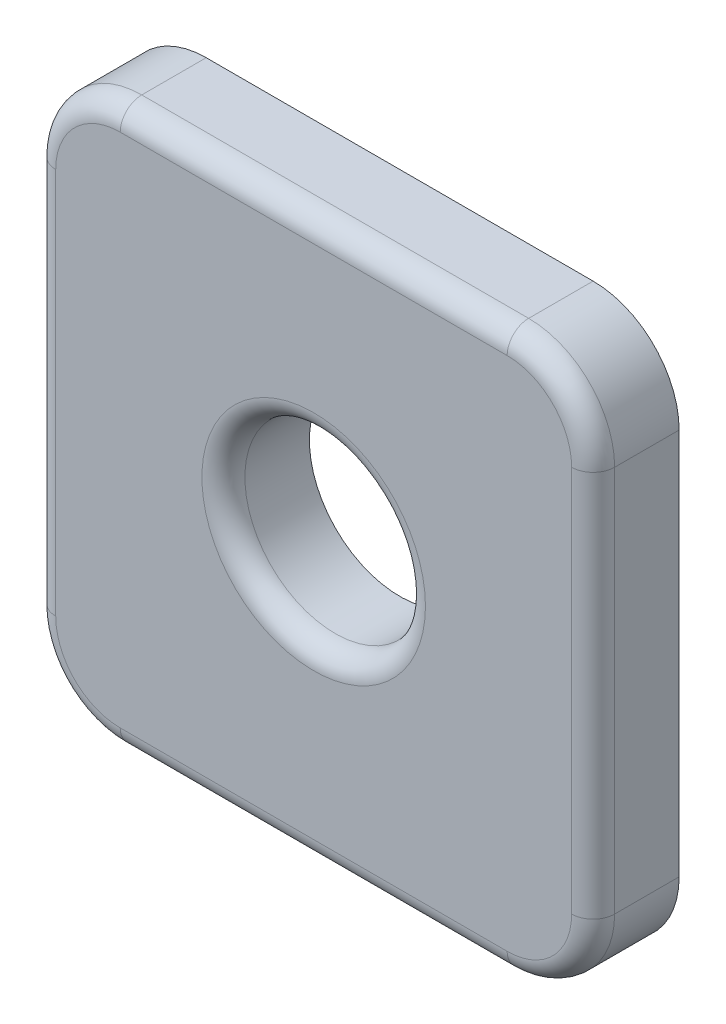
ISO-10303-21;
HEADER;
FILE_DESCRIPTION(('STEP AP214'),'2;1');
FILE_NAME('part.step','',(''),(''),'','','');
FILE_SCHEMA(('AUTOMOTIVE_DESIGN { 1 0 10303 214 1 1 1 1 }'));
ENDSEC;
DATA;
#1=APPLICATION_CONTEXT('core data for automotive mechanical design processes');
#2=APPLICATION_PROTOCOL_DEFINITION('international standard','automotive_design',2000,#1);
#3=PRODUCT_CONTEXT('',#1,'mechanical');
#4=PRODUCT('Part','Part','',(#3));
#5=PRODUCT_RELATED_PRODUCT_CATEGORY('part','',(#4));
#6=PRODUCT_DEFINITION_FORMATION('','',#4);
#7=PRODUCT_DEFINITION_CONTEXT('part definition',#1,'design');
#8=PRODUCT_DEFINITION('design','',#6,#7);
#9=PRODUCT_DEFINITION_SHAPE('','',#8);
#10=(LENGTH_UNIT() NAMED_UNIT(*) SI_UNIT(.MILLI.,.METRE.));
#11=(NAMED_UNIT(*) PLANE_ANGLE_UNIT() SI_UNIT($,.RADIAN.));
#12=(NAMED_UNIT(*) SI_UNIT($,.STERADIAN.) SOLID_ANGLE_UNIT());
#13=UNCERTAINTY_MEASURE_WITH_UNIT(LENGTH_MEASURE(1.E-05),#10,'distance_accuracy_value','');
#14=(GEOMETRIC_REPRESENTATION_CONTEXT(3) GLOBAL_UNCERTAINTY_ASSIGNED_CONTEXT((#13)) GLOBAL_UNIT_ASSIGNED_CONTEXT((#10,
#11,#12)) REPRESENTATION_CONTEXT('',''));
#15=CARTESIAN_POINT('',(0.,0.,0.));
#16=DIRECTION('',(0.,0.,1.));
#17=DIRECTION('',(1.,0.,0.));
#18=AXIS2_PLACEMENT_3D('',#15,#16,#17);
#19=CARTESIAN_POINT('',(0.,0.,2.));
#20=DIRECTION('',(0.,0.,1.));
#21=DIRECTION('',(1.,0.,0.));
#22=AXIS2_PLACEMENT_3D('',#19,#20,#21);
#23=PLANE('',#22);
#24=CARTESIAN_POINT('',(-5.03557152621005,2.28930817610063,2.));
#25=DIRECTION('',(0.,0.,1.));
#26=DIRECTION('',(1.,0.,0.));
#27=AXIS2_PLACEMENT_3D('',#24,#25,#26);
#28=CIRCLE('',#27,2.6);
#29=CARTESIAN_POINT('',(-2.43557152621005,2.28930817610063,2.));
#30=VERTEX_POINT('',#29);
#31=EDGE_CURVE('E188',#30,#30,#28,.F.);
#32=ORIENTED_EDGE('',*,*,#31,.T.);
#33=EDGE_LOOP('',(#32));
#34=FACE_BOUND('',#33,.T.);
#35=DIRECTION('',(-1.,0.,0.));
#36=VECTOR('',#35,1.);
#37=CARTESIAN_POINT('',(-9.53557152621005,8.28930817610063,2.));
#38=LINE('',#37,#36);
#39=CARTESIAN_POINT('',(-0.53557152621005,8.28930817610063,2.));
#40=VERTEX_POINT('',#39);
#41=CARTESIAN_POINT('',(-9.53557152621005,8.28930817610063,2.));
#42=VERTEX_POINT('',#41);
#43=EDGE_CURVE('E183',#40,#42,#38,.T.);
#44=ORIENTED_EDGE('',*,*,#43,.T.);
#45=CARTESIAN_POINT('',(-9.53557152621005,6.78930817610063,2.));
#46=DIRECTION('',(0.,0.,1.));
#47=DIRECTION('',(1.,0.,0.));
#48=AXIS2_PLACEMENT_3D('',#45,#46,#47);
#49=CIRCLE('',#48,1.5);
#50=CARTESIAN_POINT('',(-11.03557152621,6.78930817610063,2.));
#51=VERTEX_POINT('',#50);
#52=EDGE_CURVE('E185',#42,#51,#49,.T.);
#53=ORIENTED_EDGE('',*,*,#52,.T.);
#54=DIRECTION('',(0.,-1.,0.));
#55=VECTOR('',#54,1.);
#56=CARTESIAN_POINT('',(-11.03557152621,-2.21069182389937,2.));
#57=LINE('',#56,#55);
#58=CARTESIAN_POINT('',(-11.03557152621,-2.21069182389937,2.));
#59=VERTEX_POINT('',#58);
#60=EDGE_CURVE('E171',#51,#59,#57,.T.);
#61=ORIENTED_EDGE('',*,*,#60,.T.);
#62=CARTESIAN_POINT('',(-9.53557152621005,-2.21069182389937,2.));
#63=DIRECTION('',(0.,0.,1.));
#64=DIRECTION('',(1.,0.,0.));
#65=AXIS2_PLACEMENT_3D('',#62,#63,#64);
#66=CIRCLE('',#65,1.5);
#67=CARTESIAN_POINT('',(-9.53557152621005,-3.71069182389937,2.));
#68=VERTEX_POINT('',#67);
#69=EDGE_CURVE('E173',#59,#68,#66,.T.);
#70=ORIENTED_EDGE('',*,*,#69,.T.);
#71=DIRECTION('',(1.,0.,0.));
#72=VECTOR('',#71,1.);
#73=CARTESIAN_POINT('',(-0.535571526210052,-3.71069182389937,2.));
#74=LINE('',#73,#72);
#75=CARTESIAN_POINT('',(-0.535571526210048,-3.71069182389937,2.));
#76=VERTEX_POINT('',#75);
#77=EDGE_CURVE('E175',#68,#76,#74,.T.);
#78=ORIENTED_EDGE('',*,*,#77,.T.);
#79=CARTESIAN_POINT('',(-0.535571526210049,-2.21069182389937,2.));
#80=DIRECTION('',(0.,0.,1.));
#81=DIRECTION('',(1.,0.,0.));
#82=AXIS2_PLACEMENT_3D('',#79,#80,#81);
#83=CIRCLE('',#82,1.5);
#84=CARTESIAN_POINT('',(0.964428473789951,-2.21069182389937,2.));
#85=VERTEX_POINT('',#84);
#86=EDGE_CURVE('E177',#76,#85,#83,.T.);
#87=ORIENTED_EDGE('',*,*,#86,.T.);
#88=DIRECTION('',(0.,1.,0.));
#89=VECTOR('',#88,1.);
#90=CARTESIAN_POINT('',(0.96442847378995,6.78930817610063,2.));
#91=LINE('',#90,#89);
#92=CARTESIAN_POINT('',(0.96442847378995,6.78930817610063,2.));
#93=VERTEX_POINT('',#92);
#94=EDGE_CURVE('E179',#85,#93,#91,.T.);
#95=ORIENTED_EDGE('',*,*,#94,.T.);
#96=CARTESIAN_POINT('',(-0.53557152621005,6.78930817610063,2.));
#97=DIRECTION('',(0.,0.,1.));
#98=DIRECTION('',(1.,0.,0.));
#99=AXIS2_PLACEMENT_3D('',#96,#97,#98);
#100=CIRCLE('',#99,1.5);
#101=EDGE_CURVE('E181',#93,#40,#100,.T.);
#102=ORIENTED_EDGE('',*,*,#101,.T.);
#103=EDGE_LOOP('',(#44,#53,#61,#70,#78,#87,#95,#102));
#104=FACE_BOUND('',#103,.T.);
#105=ADVANCED_FACE('F33',(#34,#104),#23,.T.);
#106=CARTESIAN_POINT('',(0.,0.,0.));
#107=DIRECTION('',(0.,0.,1.));
#108=DIRECTION('',(1.,0.,0.));
#109=AXIS2_PLACEMENT_3D('',#106,#107,#108);
#110=PLANE('',#109);
#111=DIRECTION('',(1.,0.,0.));
#112=VECTOR('',#111,1.);
#113=CARTESIAN_POINT('',(-11.53557152621,-4.21069182389937,0.));
#114=LINE('',#113,#112);
#115=CARTESIAN_POINT('',(-9.53557152621005,-4.21069182389937,0.));
#116=VERTEX_POINT('',#115);
#117=CARTESIAN_POINT('',(-0.535571526210052,-4.21069182389937,0.));
#118=VERTEX_POINT('',#117);
#119=EDGE_CURVE('E126',#116,#118,#114,.T.);
#120=ORIENTED_EDGE('',*,*,#119,.F.);
#121=CARTESIAN_POINT('',(-9.53557152621005,-2.21069182389937,0.));
#122=DIRECTION('',(0.,0.,1.));
#123=DIRECTION('',(1.,0.,0.));
#124=AXIS2_PLACEMENT_3D('',#121,#122,#123);
#125=CIRCLE('',#124,2.);
#126=CARTESIAN_POINT('',(-11.53557152621,-2.21069182389937,0.));
#127=VERTEX_POINT('',#126);
#128=EDGE_CURVE('E132',#116,#127,#125,.F.);
#129=ORIENTED_EDGE('',*,*,#128,.T.);
#130=DIRECTION('',(0.,-1.,0.));
#131=VECTOR('',#130,1.);
#132=CARTESIAN_POINT('',(-11.53557152621,8.78930817610063,0.));
#133=LINE('',#132,#131);
#134=CARTESIAN_POINT('',(-11.53557152621,6.78930817610063,0.));
#135=VERTEX_POINT('',#134);
#136=EDGE_CURVE('E145',#135,#127,#133,.T.);
#137=ORIENTED_EDGE('',*,*,#136,.F.);
#138=CARTESIAN_POINT('',(-9.53557152621005,6.78930817610063,0.));
#139=DIRECTION('',(0.,0.,1.));
#140=DIRECTION('',(1.,0.,0.));
#141=AXIS2_PLACEMENT_3D('',#138,#139,#140);
#142=CIRCLE('',#141,2.);
#143=CARTESIAN_POINT('',(-9.53557152621005,8.78930817610063,0.));
#144=VERTEX_POINT('',#143);
#145=EDGE_CURVE('E153',#135,#144,#142,.F.);
#146=ORIENTED_EDGE('',*,*,#145,.T.);
#147=DIRECTION('',(-1.,0.,0.));
#148=VECTOR('',#147,1.);
#149=CARTESIAN_POINT('',(-11.53557152621,8.78930817610063,0.));
#150=LINE('',#149,#148);
#151=CARTESIAN_POINT('',(-0.535571526210053,8.78930817610063,0.));
#152=VERTEX_POINT('',#151);
#153=EDGE_CURVE('E148',#152,#144,#150,.T.);
#154=ORIENTED_EDGE('',*,*,#153,.F.);
#155=CARTESIAN_POINT('',(-0.53557152621005,6.78930817610063,0.));
#156=DIRECTION('',(0.,0.,1.));
#157=DIRECTION('',(1.,0.,0.));
#158=AXIS2_PLACEMENT_3D('',#155,#156,#157);
#159=CIRCLE('',#158,2.);
#160=CARTESIAN_POINT('',(1.46442847378995,6.78930817610063,0.));
#161=VERTEX_POINT('',#160);
#162=EDGE_CURVE('E129',#152,#161,#159,.F.);
#163=ORIENTED_EDGE('',*,*,#162,.T.);
#164=DIRECTION('',(0.,1.,0.));
#165=VECTOR('',#164,1.);
#166=CARTESIAN_POINT('',(1.46442847378995,8.78930817610063,0.));
#167=LINE('',#166,#165);
#168=CARTESIAN_POINT('',(1.46442847378995,-2.21069182389937,0.));
#169=VERTEX_POINT('',#168);
#170=EDGE_CURVE('E231',#169,#161,#167,.T.);
#171=ORIENTED_EDGE('',*,*,#170,.F.);
#172=CARTESIAN_POINT('',(-0.535571526210049,-2.21069182389937,0.));
#173=DIRECTION('',(0.,0.,1.));
#174=DIRECTION('',(1.,0.,0.));
#175=AXIS2_PLACEMENT_3D('',#172,#173,#174);
#176=CIRCLE('',#175,2.);
#177=EDGE_CURVE('E139',#169,#118,#176,.F.);
#178=ORIENTED_EDGE('',*,*,#177,.T.);
#179=EDGE_LOOP('',(#120,#129,#137,#146,#154,#163,#171,#178));
#180=FACE_BOUND('',#179,.T.);
#181=CARTESIAN_POINT('',(-5.03557152621005,2.28930817610063,0.));
#182=DIRECTION('',(0.,0.,1.));
#183=DIRECTION('',(1.,0.,0.));
#184=AXIS2_PLACEMENT_3D('',#181,#182,#183);
#185=CIRCLE('',#184,2.1);
#186=CARTESIAN_POINT('',(-2.93557152621005,2.28930817610063,0.));
#187=VERTEX_POINT('',#186);
#188=EDGE_CURVE('E225',#187,#187,#185,.T.);
#189=ORIENTED_EDGE('',*,*,#188,.T.);
#190=EDGE_LOOP('',(#189));
#191=FACE_BOUND('',#190,.T.);
#192=ADVANCED_FACE('F141',(#180,#191),#110,.F.);
#193=CARTESIAN_POINT('',(1.46442847378995,8.78930817610063,2.));
#194=DIRECTION('',(-1.,0.,0.));
#195=DIRECTION('',(0.,-1.,0.));
#196=AXIS2_PLACEMENT_3D('',#193,#194,#195);
#197=PLANE('',#196);
#198=DIRECTION('',(0.,0.,-1.));
#199=VECTOR('',#198,1.);
#200=CARTESIAN_POINT('',(1.46442847378995,6.78930817610063,2.));
#201=LINE('',#200,#199);
#202=CARTESIAN_POINT('',(1.46442847378995,6.78930817610063,1.5));
#203=VERTEX_POINT('',#202);
#204=EDGE_CURVE('E158',#161,#203,#201,.F.);
#205=ORIENTED_EDGE('',*,*,#204,.T.);
#206=DIRECTION('',(0.,1.,0.));
#207=VECTOR('',#206,1.);
#208=CARTESIAN_POINT('',(1.46442847378995,-2.21069182389937,1.5));
#209=LINE('',#208,#207);
#210=CARTESIAN_POINT('',(1.46442847378995,-2.21069182389937,1.5));
#211=VERTEX_POINT('',#210);
#212=EDGE_CURVE('E198',#203,#211,#209,.F.);
#213=ORIENTED_EDGE('',*,*,#212,.T.);
#214=DIRECTION('',(0.,0.,-1.));
#215=VECTOR('',#214,1.);
#216=CARTESIAN_POINT('',(1.46442847378995,-2.21069182389937,2.));
#217=LINE('',#216,#215);
#218=EDGE_CURVE('E161',#211,#169,#217,.T.);
#219=ORIENTED_EDGE('',*,*,#218,.T.);
#220=ORIENTED_EDGE('',*,*,#170,.T.);
#221=EDGE_LOOP('',(#205,#213,#219,#220));
#222=FACE_BOUND('',#221,.T.);
#223=ADVANCED_FACE('F276',(#222),#197,.F.);
#224=CARTESIAN_POINT('',(-11.53557152621,8.78930817610063,2.));
#225=DIRECTION('',(0.,-1.,0.));
#226=DIRECTION('',(0.,0.,-1.));
#227=AXIS2_PLACEMENT_3D('',#224,#225,#226);
#228=PLANE('',#227);
#229=DIRECTION('',(0.,0.,-1.));
#230=VECTOR('',#229,1.);
#231=CARTESIAN_POINT('',(-9.53557152621005,8.78930817610063,2.));
#232=LINE('',#231,#230);
#233=CARTESIAN_POINT('',(-9.53557152621005,8.78930817610063,1.5));
#234=VERTEX_POINT('',#233);
#235=EDGE_CURVE('E165',#144,#234,#232,.F.);
#236=ORIENTED_EDGE('',*,*,#235,.T.);
#237=DIRECTION('',(-1.,0.,0.));
#238=VECTOR('',#237,1.);
#239=CARTESIAN_POINT('',(-0.535571526210053,8.78930817610063,1.5));
#240=LINE('',#239,#238);
#241=CARTESIAN_POINT('',(-0.53557152621005,8.78930817610063,1.5));
#242=VERTEX_POINT('',#241);
#243=EDGE_CURVE('E194',#234,#242,#240,.F.);
#244=ORIENTED_EDGE('',*,*,#243,.T.);
#245=DIRECTION('',(0.,0.,-1.));
#246=VECTOR('',#245,1.);
#247=CARTESIAN_POINT('',(-0.53557152621005,8.78930817610063,2.));
#248=LINE('',#247,#246);
#249=EDGE_CURVE('E163',#242,#152,#248,.T.);
#250=ORIENTED_EDGE('',*,*,#249,.T.);
#251=ORIENTED_EDGE('',*,*,#153,.T.);
#252=EDGE_LOOP('',(#236,#244,#250,#251));
#253=FACE_BOUND('',#252,.T.);
#254=ADVANCED_FACE('F240',(#253),#228,.F.);
#255=CARTESIAN_POINT('',(-11.53557152621,8.78930817610063,2.));
#256=DIRECTION('',(1.,0.,0.));
#257=DIRECTION('',(0.,1.,0.));
#258=AXIS2_PLACEMENT_3D('',#255,#256,#257);
#259=PLANE('',#258);
#260=DIRECTION('',(0.,0.,-1.));
#261=VECTOR('',#260,1.);
#262=CARTESIAN_POINT('',(-11.53557152621,-2.21069182389937,2.));
#263=LINE('',#262,#261);
#264=CARTESIAN_POINT('',(-11.53557152621,-2.21069182389937,1.5));
#265=VERTEX_POINT('',#264);
#266=EDGE_CURVE('E134',#127,#265,#263,.F.);
#267=ORIENTED_EDGE('',*,*,#266,.T.);
#268=DIRECTION('',(0.,-1.,0.));
#269=VECTOR('',#268,1.);
#270=CARTESIAN_POINT('',(-11.53557152621,6.78930817610063,1.5));
#271=LINE('',#270,#269);
#272=CARTESIAN_POINT('',(-11.53557152621,6.78930817610063,1.5));
#273=VERTEX_POINT('',#272);
#274=EDGE_CURVE('E11',#265,#273,#271,.F.);
#275=ORIENTED_EDGE('',*,*,#274,.T.);
#276=DIRECTION('',(0.,0.,-1.));
#277=VECTOR('',#276,1.);
#278=CARTESIAN_POINT('',(-11.53557152621,6.78930817610063,2.));
#279=LINE('',#278,#277);
#280=EDGE_CURVE('E138',#273,#135,#279,.T.);
#281=ORIENTED_EDGE('',*,*,#280,.T.);
#282=ORIENTED_EDGE('',*,*,#136,.T.);
#283=EDGE_LOOP('',(#267,#275,#281,#282));
#284=FACE_BOUND('',#283,.T.);
#285=ADVANCED_FACE('F305',(#284),#259,.F.);
#286=CARTESIAN_POINT('',(-11.53557152621,-4.21069182389937,2.));
#287=DIRECTION('',(0.,1.,0.));
#288=DIRECTION('',(0.,0.,1.));
#289=AXIS2_PLACEMENT_3D('',#286,#287,#288);
#290=PLANE('',#289);
#291=DIRECTION('',(0.,0.,-1.));
#292=VECTOR('',#291,1.);
#293=CARTESIAN_POINT('',(-0.535571526210048,-4.21069182389937,2.));
#294=LINE('',#293,#292);
#295=CARTESIAN_POINT('',(-0.535571526210048,-4.21069182389937,1.5));
#296=VERTEX_POINT('',#295);
#297=EDGE_CURVE('E130',#118,#296,#294,.F.);
#298=ORIENTED_EDGE('',*,*,#297,.T.);
#299=DIRECTION('',(1.,0.,0.));
#300=VECTOR('',#299,1.);
#301=CARTESIAN_POINT('',(-9.53557152621005,-4.21069182389937,1.5));
#302=LINE('',#301,#300);
#303=CARTESIAN_POINT('',(-9.53557152621005,-4.21069182389937,1.5));
#304=VERTEX_POINT('',#303);
#305=EDGE_CURVE('E57',#296,#304,#302,.F.);
#306=ORIENTED_EDGE('',*,*,#305,.T.);
#307=DIRECTION('',(0.,0.,-1.));
#308=VECTOR('',#307,1.);
#309=CARTESIAN_POINT('',(-9.53557152621005,-4.21069182389937,2.));
#310=LINE('',#309,#308);
#311=EDGE_CURVE('E122',#304,#116,#310,.T.);
#312=ORIENTED_EDGE('',*,*,#311,.T.);
#313=ORIENTED_EDGE('',*,*,#119,.T.);
#314=EDGE_LOOP('',(#298,#306,#312,#313));
#315=FACE_BOUND('',#314,.T.);
#316=ADVANCED_FACE('F124',(#315),#290,.F.);
#317=CARTESIAN_POINT('',(-5.03557152621005,2.28930817610063,2.));
#318=DIRECTION('',(0.,0.,-1.));
#319=DIRECTION('',(-1.,0.,0.));
#320=AXIS2_PLACEMENT_3D('',#317,#318,#319);
#321=CYLINDRICAL_SURFACE('',#320,2.1);
#322=CARTESIAN_POINT('',(-5.03557152621005,2.28930817610063,1.5));
#323=DIRECTION('',(0.,0.,1.));
#324=DIRECTION('',(1.,0.,0.));
#325=AXIS2_PLACEMENT_3D('',#322,#323,#324);
#326=CIRCLE('',#325,2.1);
#327=CARTESIAN_POINT('',(-2.93557152621005,2.28930817610063,1.5));
#328=VERTEX_POINT('',#327);
#329=EDGE_CURVE('E168',#328,#328,#326,.T.);
#330=ORIENTED_EDGE('',*,*,#329,.T.);
#331=EDGE_LOOP('',(#330));
#332=FACE_BOUND('',#331,.T.);
#333=ORIENTED_EDGE('',*,*,#188,.F.);
#334=EDGE_LOOP('',(#333));
#335=FACE_BOUND('',#334,.T.);
#336=ADVANCED_FACE('F301',(#332,#335),#321,.F.);
#337=CARTESIAN_POINT('',(-9.53557152621005,-2.21069182389937,2.));
#338=DIRECTION('',(0.,0.,-1.));
#339=DIRECTION('',(-1.,0.,0.));
#340=AXIS2_PLACEMENT_3D('',#337,#338,#339);
#341=CYLINDRICAL_SURFACE('',#340,2.);
#342=ORIENTED_EDGE('',*,*,#311,.F.);
#343=CARTESIAN_POINT('',(-9.53557152621005,-2.21069182389937,1.5));
#344=DIRECTION('',(0.,0.,1.));
#345=DIRECTION('',(1.,0.,0.));
#346=AXIS2_PLACEMENT_3D('',#343,#344,#345);
#347=CIRCLE('',#346,2.);
#348=EDGE_CURVE('E42',#304,#265,#347,.F.);
#349=ORIENTED_EDGE('',*,*,#348,.T.);
#350=ORIENTED_EDGE('',*,*,#266,.F.);
#351=ORIENTED_EDGE('',*,*,#128,.F.);
#352=EDGE_LOOP('',(#342,#349,#350,#351));
#353=FACE_BOUND('',#352,.T.);
#354=ADVANCED_FACE('F133',(#353),#341,.T.);
#355=CARTESIAN_POINT('',(-0.535571526210049,-2.21069182389937,2.));
#356=DIRECTION('',(0.,0.,-1.));
#357=DIRECTION('',(-1.,0.,0.));
#358=AXIS2_PLACEMENT_3D('',#355,#356,#357);
#359=CYLINDRICAL_SURFACE('',#358,2.);
#360=ORIENTED_EDGE('',*,*,#218,.F.);
#361=CARTESIAN_POINT('',(-0.535571526210049,-2.21069182389937,1.5));
#362=DIRECTION('',(0.,0.,1.));
#363=DIRECTION('',(1.,0.,0.));
#364=AXIS2_PLACEMENT_3D('',#361,#362,#363);
#365=CIRCLE('',#364,2.);
#366=EDGE_CURVE('E200',#211,#296,#365,.F.);
#367=ORIENTED_EDGE('',*,*,#366,.T.);
#368=ORIENTED_EDGE('',*,*,#297,.F.);
#369=ORIENTED_EDGE('',*,*,#177,.F.);
#370=EDGE_LOOP('',(#360,#367,#368,#369));
#371=FACE_BOUND('',#370,.T.);
#372=ADVANCED_FACE('F279',(#371),#359,.T.);
#373=CARTESIAN_POINT('',(-9.53557152621005,6.78930817610063,2.));
#374=DIRECTION('',(0.,0.,-1.));
#375=DIRECTION('',(-1.,0.,0.));
#376=AXIS2_PLACEMENT_3D('',#373,#374,#375);
#377=CYLINDRICAL_SURFACE('',#376,2.);
#378=ORIENTED_EDGE('',*,*,#280,.F.);
#379=CARTESIAN_POINT('',(-9.53557152621005,6.78930817610063,1.5));
#380=DIRECTION('',(0.,0.,1.));
#381=DIRECTION('',(1.,0.,0.));
#382=AXIS2_PLACEMENT_3D('',#379,#380,#381);
#383=CIRCLE('',#382,2.);
#384=EDGE_CURVE('E191',#273,#234,#383,.F.);
#385=ORIENTED_EDGE('',*,*,#384,.T.);
#386=ORIENTED_EDGE('',*,*,#235,.F.);
#387=ORIENTED_EDGE('',*,*,#145,.F.);
#388=EDGE_LOOP('',(#378,#385,#386,#387));
#389=FACE_BOUND('',#388,.T.);
#390=ADVANCED_FACE('F246',(#389),#377,.T.);
#391=CARTESIAN_POINT('',(-0.53557152621005,6.78930817610063,2.));
#392=DIRECTION('',(0.,0.,-1.));
#393=DIRECTION('',(-1.,0.,0.));
#394=AXIS2_PLACEMENT_3D('',#391,#392,#393);
#395=CYLINDRICAL_SURFACE('',#394,2.);
#396=ORIENTED_EDGE('',*,*,#249,.F.);
#397=CARTESIAN_POINT('',(-0.53557152621005,6.78930817610063,1.5));
#398=DIRECTION('',(0.,0.,1.));
#399=DIRECTION('',(1.,0.,0.));
#400=AXIS2_PLACEMENT_3D('',#397,#398,#399);
#401=CIRCLE('',#400,2.);
#402=EDGE_CURVE('E196',#242,#203,#401,.F.);
#403=ORIENTED_EDGE('',*,*,#402,.T.);
#404=ORIENTED_EDGE('',*,*,#204,.F.);
#405=ORIENTED_EDGE('',*,*,#162,.F.);
#406=EDGE_LOOP('',(#396,#403,#404,#405));
#407=FACE_BOUND('',#406,.T.);
#408=ADVANCED_FACE('F268',(#407),#395,.T.);
#409=CARTESIAN_POINT('',(-5.03557152621005,2.28930817610063,1.5));
#410=DIRECTION('',(0.,0.,1.));
#411=DIRECTION('',(1.,0.,0.));
#412=AXIS2_PLACEMENT_3D('',#409,#410,#411);
#413=TOROIDAL_SURFACE('',#412,2.6,0.5);
#414=ORIENTED_EDGE('',*,*,#31,.F.);
#415=EDGE_LOOP('',(#414));
#416=FACE_BOUND('',#415,.T.);
#417=ORIENTED_EDGE('',*,*,#329,.F.);
#418=EDGE_LOOP('',(#417));
#419=FACE_BOUND('',#418,.T.);
#420=ADVANCED_FACE('F321',(#416,#419),#413,.T.);
#421=CARTESIAN_POINT('',(-0.535571526210049,-2.21069182389937,1.5));
#422=DIRECTION('',(0.,0.,1.));
#423=DIRECTION('',(1.,0.,0.));
#424=AXIS2_PLACEMENT_3D('',#421,#422,#423);
#425=TOROIDAL_SURFACE('',#424,1.5,0.5);
#426=CARTESIAN_POINT('',(-0.535571526210048,-3.71069182389937,1.5));
#427=DIRECTION('',(-1.,0.,0.));
#428=DIRECTION('',(0.,-1.,0.));
#429=AXIS2_PLACEMENT_3D('',#426,#427,#428);
#430=CIRCLE('',#429,0.5);
#431=EDGE_CURVE('E219',#296,#76,#430,.T.);
#432=ORIENTED_EDGE('',*,*,#431,.F.);
#433=ORIENTED_EDGE('',*,*,#366,.F.);
#434=CARTESIAN_POINT('',(0.964428473789951,-2.21069182389937,1.5));
#435=DIRECTION('',(0.,1.,0.));
#436=DIRECTION('',(0.,0.,1.));
#437=AXIS2_PLACEMENT_3D('',#434,#435,#436);
#438=CIRCLE('',#437,0.5);
#439=EDGE_CURVE('E37',#85,#211,#438,.T.);
#440=ORIENTED_EDGE('',*,*,#439,.F.);
#441=ORIENTED_EDGE('',*,*,#86,.F.);
#442=EDGE_LOOP('',(#432,#433,#440,#441));
#443=FACE_BOUND('',#442,.T.);
#444=ADVANCED_FACE('F35',(#443),#425,.T.);
#445=CARTESIAN_POINT('',(0.964428473789951,0.,1.5));
#446=DIRECTION('',(0.,-1.,0.));
#447=DIRECTION('',(1.,0.,0.));
#448=AXIS2_PLACEMENT_3D('',#445,#446,#447);
#449=CYLINDRICAL_SURFACE('',#448,0.5);
#450=ORIENTED_EDGE('',*,*,#439,.T.);
#451=ORIENTED_EDGE('',*,*,#212,.F.);
#452=CARTESIAN_POINT('',(0.96442847378995,6.78930817610063,1.5));
#453=DIRECTION('',(0.,1.,0.));
#454=DIRECTION('',(0.,0.,1.));
#455=AXIS2_PLACEMENT_3D('',#452,#453,#454);
#456=CIRCLE('',#455,0.5);
#457=EDGE_CURVE('E217',#93,#203,#456,.T.);
#458=ORIENTED_EDGE('',*,*,#457,.F.);
#459=ORIENTED_EDGE('',*,*,#94,.F.);
#460=EDGE_LOOP('',(#450,#451,#458,#459));
#461=FACE_BOUND('',#460,.T.);
#462=ADVANCED_FACE('F273',(#461),#449,.T.);
#463=CARTESIAN_POINT('',(0.,-3.71069182389937,1.5));
#464=DIRECTION('',(-1.,0.,0.));
#465=DIRECTION('',(0.,0.,1.));
#466=AXIS2_PLACEMENT_3D('',#463,#464,#465);
#467=CYLINDRICAL_SURFACE('',#466,0.5);
#468=ORIENTED_EDGE('',*,*,#431,.T.);
#469=ORIENTED_EDGE('',*,*,#77,.F.);
#470=CARTESIAN_POINT('',(-9.53557152621005,-3.71069182389937,1.5));
#471=DIRECTION('',(-1.,0.,0.));
#472=DIRECTION('',(0.,0.,1.));
#473=AXIS2_PLACEMENT_3D('',#470,#471,#472);
#474=CIRCLE('',#473,0.5);
#475=EDGE_CURVE('E214',#304,#68,#474,.T.);
#476=ORIENTED_EDGE('',*,*,#475,.F.);
#477=ORIENTED_EDGE('',*,*,#305,.F.);
#478=EDGE_LOOP('',(#468,#469,#476,#477));
#479=FACE_BOUND('',#478,.T.);
#480=ADVANCED_FACE('F282',(#479),#467,.T.);
#481=CARTESIAN_POINT('',(-0.53557152621005,6.78930817610063,1.5));
#482=DIRECTION('',(0.,0.,1.));
#483=DIRECTION('',(1.,0.,0.));
#484=AXIS2_PLACEMENT_3D('',#481,#482,#483);
#485=TOROIDAL_SURFACE('',#484,1.5,0.5);
#486=ORIENTED_EDGE('',*,*,#457,.T.);
#487=ORIENTED_EDGE('',*,*,#402,.F.);
#488=CARTESIAN_POINT('',(-0.53557152621005,8.28930817610063,1.5));
#489=DIRECTION('',(-1.,0.,0.));
#490=DIRECTION('',(0.,0.,1.));
#491=AXIS2_PLACEMENT_3D('',#488,#489,#490);
#492=CIRCLE('',#491,0.5);
#493=EDGE_CURVE('E211',#40,#242,#492,.T.);
#494=ORIENTED_EDGE('',*,*,#493,.F.);
#495=ORIENTED_EDGE('',*,*,#101,.F.);
#496=EDGE_LOOP('',(#486,#487,#494,#495));
#497=FACE_BOUND('',#496,.T.);
#498=ADVANCED_FACE('F271',(#497),#485,.T.);
#499=CARTESIAN_POINT('',(-9.53557152621005,-2.21069182389937,1.5));
#500=DIRECTION('',(0.,0.,1.));
#501=DIRECTION('',(1.,0.,0.));
#502=AXIS2_PLACEMENT_3D('',#499,#500,#501);
#503=TOROIDAL_SURFACE('',#502,1.5,0.5);
#504=ORIENTED_EDGE('',*,*,#475,.T.);
#505=ORIENTED_EDGE('',*,*,#69,.F.);
#506=CARTESIAN_POINT('',(-11.03557152621,-2.21069182389937,1.5));
#507=DIRECTION('',(0.,1.,0.));
#508=DIRECTION('',(0.,0.,1.));
#509=AXIS2_PLACEMENT_3D('',#506,#507,#508);
#510=CIRCLE('',#509,0.5);
#511=EDGE_CURVE('E208',#265,#59,#510,.T.);
#512=ORIENTED_EDGE('',*,*,#511,.F.);
#513=ORIENTED_EDGE('',*,*,#348,.F.);
#514=EDGE_LOOP('',(#504,#505,#512,#513));
#515=FACE_BOUND('',#514,.T.);
#516=ADVANCED_FACE('F284',(#515),#503,.T.);
#517=CARTESIAN_POINT('',(0.,8.28930817610063,1.5));
#518=DIRECTION('',(1.,0.,0.));
#519=DIRECTION('',(0.,0.,-1.));
#520=AXIS2_PLACEMENT_3D('',#517,#518,#519);
#521=CYLINDRICAL_SURFACE('',#520,0.5);
#522=ORIENTED_EDGE('',*,*,#493,.T.);
#523=ORIENTED_EDGE('',*,*,#243,.F.);
#524=CARTESIAN_POINT('',(-9.53557152621005,8.28930817610063,1.5));
#525=DIRECTION('',(-1.,0.,0.));
#526=DIRECTION('',(0.,0.,1.));
#527=AXIS2_PLACEMENT_3D('',#524,#525,#526);
#528=CIRCLE('',#527,0.5);
#529=EDGE_CURVE('E206',#42,#234,#528,.T.);
#530=ORIENTED_EDGE('',*,*,#529,.F.);
#531=ORIENTED_EDGE('',*,*,#43,.F.);
#532=EDGE_LOOP('',(#522,#523,#530,#531));
#533=FACE_BOUND('',#532,.T.);
#534=ADVANCED_FACE('F265',(#533),#521,.T.);
#535=CARTESIAN_POINT('',(-11.03557152621,0.,1.5));
#536=DIRECTION('',(0.,1.,0.));
#537=DIRECTION('',(-1.,0.,0.));
#538=AXIS2_PLACEMENT_3D('',#535,#536,#537);
#539=CYLINDRICAL_SURFACE('',#538,0.5);
#540=ORIENTED_EDGE('',*,*,#511,.T.);
#541=ORIENTED_EDGE('',*,*,#60,.F.);
#542=CARTESIAN_POINT('',(-11.03557152621,6.78930817610063,1.5));
#543=DIRECTION('',(0.,1.,0.));
#544=DIRECTION('',(0.,0.,1.));
#545=AXIS2_PLACEMENT_3D('',#542,#543,#544);
#546=CIRCLE('',#545,0.5);
#547=EDGE_CURVE('E204',#273,#51,#546,.T.);
#548=ORIENTED_EDGE('',*,*,#547,.F.);
#549=ORIENTED_EDGE('',*,*,#274,.F.);
#550=EDGE_LOOP('',(#540,#541,#548,#549));
#551=FACE_BOUND('',#550,.T.);
#552=ADVANCED_FACE('F257',(#551),#539,.T.);
#553=CARTESIAN_POINT('',(-9.53557152621005,6.78930817610063,1.5));
#554=DIRECTION('',(0.,0.,1.));
#555=DIRECTION('',(1.,0.,0.));
#556=AXIS2_PLACEMENT_3D('',#553,#554,#555);
#557=TOROIDAL_SURFACE('',#556,1.5,0.5);
#558=ORIENTED_EDGE('',*,*,#529,.T.);
#559=ORIENTED_EDGE('',*,*,#384,.F.);
#560=ORIENTED_EDGE('',*,*,#547,.T.);
#561=ORIENTED_EDGE('',*,*,#52,.F.);
#562=EDGE_LOOP('',(#558,#559,#560,#561));
#563=FACE_BOUND('',#562,.T.);
#564=ADVANCED_FACE('F250',(#563),#557,.T.);
#565=CLOSED_SHELL('',(#105,#192,#223,#254,#285,#316,#336,#354,#372,#390,#408,#420,#444,#462,
#480,#498,#516,#534,#552,#564));
#566=MANIFOLD_SOLID_BREP('B2',#565);
#567=ADVANCED_BREP_SHAPE_REPRESENTATION('',(#18,#566),#14);
#568=SHAPE_DEFINITION_REPRESENTATION(#9,#567);
ENDSEC;
END-ISO-10303-21;
